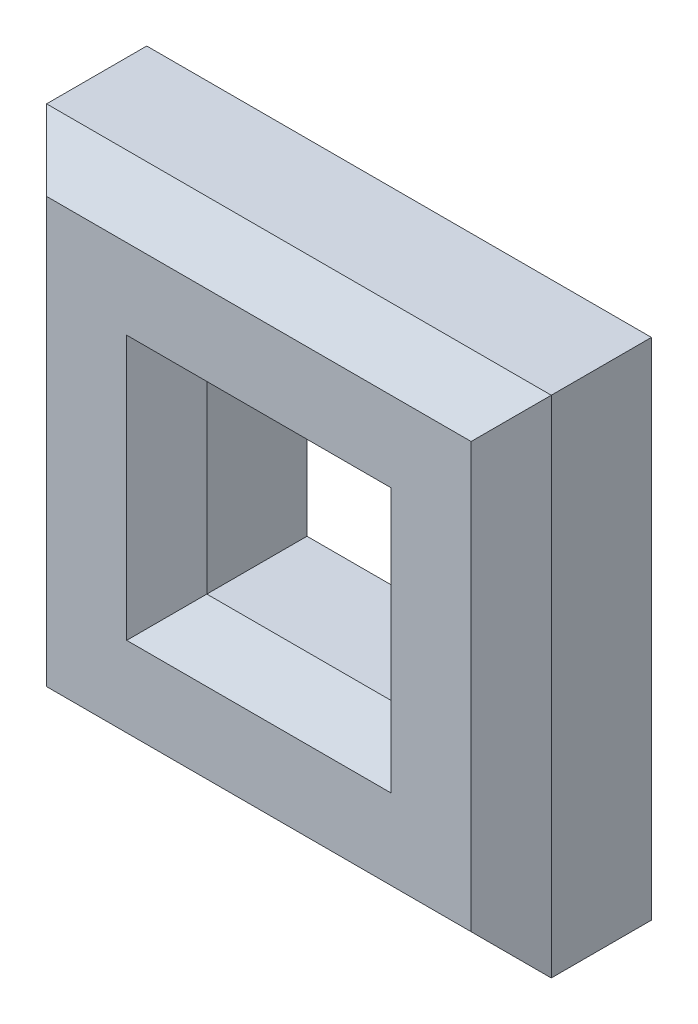
ISO-10303-21;
HEADER;
FILE_DESCRIPTION(('STEP AP214'),'2;1');
FILE_NAME('part.step','',(''),(''),'','','');
FILE_SCHEMA(('AUTOMOTIVE_DESIGN { 1 0 10303 214 1 1 1 1 }'));
ENDSEC;
DATA;
#1=APPLICATION_CONTEXT('core data for automotive mechanical design processes');
#2=APPLICATION_PROTOCOL_DEFINITION('international standard','automotive_design',2000,#1);
#3=PRODUCT_CONTEXT('',#1,'mechanical');
#4=PRODUCT('Part','Part','',(#3));
#5=PRODUCT_RELATED_PRODUCT_CATEGORY('part','',(#4));
#6=PRODUCT_DEFINITION_FORMATION('','',#4);
#7=PRODUCT_DEFINITION_CONTEXT('part definition',#1,'design');
#8=PRODUCT_DEFINITION('design','',#6,#7);
#9=PRODUCT_DEFINITION_SHAPE('','',#8);
#10=(LENGTH_UNIT() NAMED_UNIT(*) SI_UNIT(.MILLI.,.METRE.));
#11=(NAMED_UNIT(*) PLANE_ANGLE_UNIT() SI_UNIT($,.RADIAN.));
#12=(NAMED_UNIT(*) SI_UNIT($,.STERADIAN.) SOLID_ANGLE_UNIT());
#13=UNCERTAINTY_MEASURE_WITH_UNIT(LENGTH_MEASURE(1.E-05),#10,'distance_accuracy_value','');
#14=(GEOMETRIC_REPRESENTATION_CONTEXT(3) GLOBAL_UNCERTAINTY_ASSIGNED_CONTEXT((#13)) GLOBAL_UNIT_ASSIGNED_CONTEXT((#10,
#11,#12)) REPRESENTATION_CONTEXT('',''));
#15=CARTESIAN_POINT('',(0.,0.,0.));
#16=DIRECTION('',(0.,0.,1.));
#17=DIRECTION('',(1.,0.,0.));
#18=AXIS2_PLACEMENT_3D('',#15,#16,#17);
#19=CARTESIAN_POINT('',(0.,0.,3.5));
#20=DIRECTION('',(0.,0.,1.));
#21=DIRECTION('',(1.,0.,0.));
#22=AXIS2_PLACEMENT_3D('',#19,#20,#21);
#23=PLANE('',#22);
#24=DIRECTION('',(1.,0.,0.));
#25=VECTOR('',#24,1.);
#26=CARTESIAN_POINT('',(0.,3.29809703885628,3.5));
#27=LINE('',#26,#25);
#28=CARTESIAN_POINT('',(-3.29809703885628,3.29809703885628,3.5));
#29=VERTEX_POINT('',#28);
#30=CARTESIAN_POINT('',(3.29809703885628,3.29809703885628,3.5));
#31=VERTEX_POINT('',#30);
#32=EDGE_CURVE('E200',#29,#31,#27,.T.);
#33=ORIENTED_EDGE('',*,*,#32,.T.);
#34=DIRECTION('',(0.,-1.,0.));
#35=VECTOR('',#34,1.);
#36=CARTESIAN_POINT('',(3.29809703885628,0.,3.5));
#37=LINE('',#36,#35);
#38=CARTESIAN_POINT('',(3.29809703885628,-3.29809703885628,3.5));
#39=VERTEX_POINT('',#38);
#40=EDGE_CURVE('E202',#31,#39,#37,.T.);
#41=ORIENTED_EDGE('',*,*,#40,.T.);
#42=DIRECTION('',(-1.,0.,0.));
#43=VECTOR('',#42,1.);
#44=CARTESIAN_POINT('',(0.,-3.29809703885628,3.5));
#45=LINE('',#44,#43);
#46=CARTESIAN_POINT('',(-3.29809703885628,-3.29809703885628,3.5));
#47=VERTEX_POINT('',#46);
#48=EDGE_CURVE('E196',#39,#47,#45,.T.);
#49=ORIENTED_EDGE('',*,*,#48,.T.);
#50=DIRECTION('',(0.,1.,0.));
#51=VECTOR('',#50,1.);
#52=CARTESIAN_POINT('',(-3.29809703885628,0.,3.5));
#53=LINE('',#52,#51);
#54=EDGE_CURVE('E198',#47,#29,#53,.T.);
#55=ORIENTED_EDGE('',*,*,#54,.T.);
#56=EDGE_LOOP('',(#33,#41,#49,#55));
#57=FACE_BOUND('',#56,.T.);
#58=DIRECTION('',(0.,1.,0.));
#59=VECTOR('',#58,1.);
#60=CARTESIAN_POINT('',(5.29809703885629,6.29809703885628,3.5));
#61=LINE('',#60,#59);
#62=CARTESIAN_POINT('',(5.29809703885629,-5.29809703885628,3.5));
#63=VERTEX_POINT('',#62);
#64=CARTESIAN_POINT('',(5.29809703885629,5.29809703885629,3.5));
#65=VERTEX_POINT('',#64);
#66=EDGE_CURVE('E191',#63,#65,#61,.T.);
#67=ORIENTED_EDGE('',*,*,#66,.T.);
#68=DIRECTION('',(-1.,0.,0.));
#69=VECTOR('',#68,1.);
#70=CARTESIAN_POINT('',(-6.29809703885628,5.29809703885629,3.5));
#71=LINE('',#70,#69);
#72=CARTESIAN_POINT('',(-5.29809703885629,5.29809703885629,3.5));
#73=VERTEX_POINT('',#72);
#74=EDGE_CURVE('E193',#65,#73,#71,.T.);
#75=ORIENTED_EDGE('',*,*,#74,.T.);
#76=DIRECTION('',(0.,-1.,0.));
#77=VECTOR('',#76,1.);
#78=CARTESIAN_POINT('',(-5.29809703885629,-6.29809703885628,3.5));
#79=LINE('',#78,#77);
#80=CARTESIAN_POINT('',(-5.29809703885629,-5.29809703885628,3.5));
#81=VERTEX_POINT('',#80);
#82=EDGE_CURVE('E187',#73,#81,#79,.T.);
#83=ORIENTED_EDGE('',*,*,#82,.T.);
#84=DIRECTION('',(1.,0.,0.));
#85=VECTOR('',#84,1.);
#86=CARTESIAN_POINT('',(6.29809703885628,-5.29809703885628,3.5));
#87=LINE('',#86,#85);
#88=EDGE_CURVE('E189',#81,#63,#87,.T.);
#89=ORIENTED_EDGE('',*,*,#88,.T.);
#90=EDGE_LOOP('',(#67,#75,#83,#89));
#91=FACE_BOUND('',#90,.T.);
#92=ADVANCED_FACE('F35',(#57,#91),#23,.T.);
#93=CARTESIAN_POINT('',(0.,0.,0.));
#94=DIRECTION('',(0.,0.,1.));
#95=DIRECTION('',(1.,0.,0.));
#96=AXIS2_PLACEMENT_3D('',#93,#94,#95);
#97=PLANE('',#96);
#98=DIRECTION('',(0.,-1.,0.));
#99=VECTOR('',#98,1.);
#100=CARTESIAN_POINT('',(-6.29809703885628,-6.29809703885628,0.));
#101=LINE('',#100,#99);
#102=CARTESIAN_POINT('',(-6.29809703885628,6.29809703885628,0.));
#103=VERTEX_POINT('',#102);
#104=CARTESIAN_POINT('',(-6.29809703885628,-6.29809703885628,0.));
#105=VERTEX_POINT('',#104);
#106=EDGE_CURVE('E137',#103,#105,#101,.T.);
#107=ORIENTED_EDGE('',*,*,#106,.F.);
#108=DIRECTION('',(-1.,0.,0.));
#109=VECTOR('',#108,1.);
#110=CARTESIAN_POINT('',(6.29809703885628,6.29809703885628,0.));
#111=LINE('',#110,#109);
#112=CARTESIAN_POINT('',(6.29809703885628,6.29809703885628,0.));
#113=VERTEX_POINT('',#112);
#114=EDGE_CURVE('E173',#113,#103,#111,.T.);
#115=ORIENTED_EDGE('',*,*,#114,.F.);
#116=DIRECTION('',(0.,1.,0.));
#117=VECTOR('',#116,1.);
#118=CARTESIAN_POINT('',(6.29809703885628,-6.29809703885628,0.));
#119=LINE('',#118,#117);
#120=CARTESIAN_POINT('',(6.29809703885628,-6.29809703885628,0.));
#121=VERTEX_POINT('',#120);
#122=EDGE_CURVE('E170',#121,#113,#119,.T.);
#123=ORIENTED_EDGE('',*,*,#122,.F.);
#124=DIRECTION('',(1.,0.,0.));
#125=VECTOR('',#124,1.);
#126=CARTESIAN_POINT('',(6.29809703885628,-6.29809703885628,0.));
#127=LINE('',#126,#125);
#128=EDGE_CURVE('E167',#105,#121,#127,.T.);
#129=ORIENTED_EDGE('',*,*,#128,.F.);
#130=EDGE_LOOP('',(#107,#115,#123,#129));
#131=FACE_BOUND('',#130,.T.);
#132=DIRECTION('',(0.,-1.,0.));
#133=VECTOR('',#132,1.);
#134=CARTESIAN_POINT('',(-2.29809703885628,-2.29809703885628,0.));
#135=LINE('',#134,#133);
#136=CARTESIAN_POINT('',(-2.29809703885628,2.29809703885628,0.));
#137=VERTEX_POINT('',#136);
#138=CARTESIAN_POINT('',(-2.29809703885628,-2.29809703885628,0.));
#139=VERTEX_POINT('',#138);
#140=EDGE_CURVE('E131',#137,#139,#135,.T.);
#141=ORIENTED_EDGE('',*,*,#140,.T.);
#142=DIRECTION('',(1.,0.,0.));
#143=VECTOR('',#142,1.);
#144=CARTESIAN_POINT('',(2.29809703885628,-2.29809703885628,0.));
#145=LINE('',#144,#143);
#146=CARTESIAN_POINT('',(2.29809703885628,-2.29809703885628,0.));
#147=VERTEX_POINT('',#146);
#148=EDGE_CURVE('E141',#139,#147,#145,.T.);
#149=ORIENTED_EDGE('',*,*,#148,.T.);
#150=DIRECTION('',(0.,1.,0.));
#151=VECTOR('',#150,1.);
#152=CARTESIAN_POINT('',(2.29809703885628,-2.29809703885628,0.));
#153=LINE('',#152,#151);
#154=CARTESIAN_POINT('',(2.29809703885628,2.29809703885628,0.));
#155=VERTEX_POINT('',#154);
#156=EDGE_CURVE('E147',#147,#155,#153,.T.);
#157=ORIENTED_EDGE('',*,*,#156,.T.);
#158=DIRECTION('',(-1.,0.,0.));
#159=VECTOR('',#158,1.);
#160=CARTESIAN_POINT('',(2.29809703885628,2.29809703885628,0.));
#161=LINE('',#160,#159);
#162=EDGE_CURVE('E151',#155,#137,#161,.T.);
#163=ORIENTED_EDGE('',*,*,#162,.T.);
#164=EDGE_LOOP('',(#141,#149,#157,#163));
#165=FACE_BOUND('',#164,.T.);
#166=ADVANCED_FACE('F149',(#131,#165),#97,.F.);
#167=CARTESIAN_POINT('',(-6.29809703885628,-6.29809703885628,3.5));
#168=DIRECTION('',(1.,0.,0.));
#169=DIRECTION('',(0.,0.,-1.));
#170=AXIS2_PLACEMENT_3D('',#167,#168,#169);
#171=PLANE('',#170);
#172=DIRECTION('',(0.,0.,-1.));
#173=VECTOR('',#172,1.);
#174=CARTESIAN_POINT('',(-6.29809703885628,-6.29809703885628,3.5));
#175=LINE('',#174,#173);
#176=CARTESIAN_POINT('',(-6.29809703885628,-6.29809703885628,2.5));
#177=VERTEX_POINT('',#176);
#178=EDGE_CURVE('E182',#177,#105,#175,.T.);
#179=ORIENTED_EDGE('',*,*,#178,.F.);
#180=DIRECTION('',(0.,1.,0.));
#181=VECTOR('',#180,1.);
#182=CARTESIAN_POINT('',(-6.29809703885628,6.29809703885628,2.5));
#183=LINE('',#182,#181);
#184=CARTESIAN_POINT('',(-6.29809703885628,6.29809703885628,2.5));
#185=VERTEX_POINT('',#184);
#186=EDGE_CURVE('E11',#177,#185,#183,.T.);
#187=ORIENTED_EDGE('',*,*,#186,.T.);
#188=DIRECTION('',(0.,0.,-1.));
#189=VECTOR('',#188,1.);
#190=CARTESIAN_POINT('',(-6.29809703885628,6.29809703885628,3.5));
#191=LINE('',#190,#189);
#192=EDGE_CURVE('E176',#185,#103,#191,.T.);
#193=ORIENTED_EDGE('',*,*,#192,.T.);
#194=ORIENTED_EDGE('',*,*,#106,.T.);
#195=EDGE_LOOP('',(#179,#187,#193,#194));
#196=FACE_BOUND('',#195,.T.);
#197=ADVANCED_FACE('F242',(#196),#171,.F.);
#198=CARTESIAN_POINT('',(6.29809703885628,-6.29809703885628,3.5));
#199=DIRECTION('',(0.,1.,0.));
#200=DIRECTION('',(0.,0.,1.));
#201=AXIS2_PLACEMENT_3D('',#198,#199,#200);
#202=PLANE('',#201);
#203=DIRECTION('',(0.,0.,-1.));
#204=VECTOR('',#203,1.);
#205=CARTESIAN_POINT('',(6.29809703885628,-6.29809703885628,3.5));
#206=LINE('',#205,#204);
#207=CARTESIAN_POINT('',(6.29809703885628,-6.29809703885628,2.5));
#208=VERTEX_POINT('',#207);
#209=EDGE_CURVE('E180',#208,#121,#206,.T.);
#210=ORIENTED_EDGE('',*,*,#209,.F.);
#211=DIRECTION('',(-1.,0.,0.));
#212=VECTOR('',#211,1.);
#213=CARTESIAN_POINT('',(-6.29809703885628,-6.29809703885628,2.5));
#214=LINE('',#213,#212);
#215=EDGE_CURVE('E45',#208,#177,#214,.T.);
#216=ORIENTED_EDGE('',*,*,#215,.T.);
#217=ORIENTED_EDGE('',*,*,#178,.T.);
#218=ORIENTED_EDGE('',*,*,#128,.T.);
#219=EDGE_LOOP('',(#210,#216,#217,#218));
#220=FACE_BOUND('',#219,.T.);
#221=ADVANCED_FACE('F268',(#220),#202,.F.);
#222=CARTESIAN_POINT('',(6.29809703885628,-6.29809703885628,3.5));
#223=DIRECTION('',(-1.,0.,0.));
#224=DIRECTION('',(0.,0.,1.));
#225=AXIS2_PLACEMENT_3D('',#222,#223,#224);
#226=PLANE('',#225);
#227=DIRECTION('',(0.,0.,-1.));
#228=VECTOR('',#227,1.);
#229=CARTESIAN_POINT('',(6.29809703885628,6.29809703885628,3.5));
#230=LINE('',#229,#228);
#231=CARTESIAN_POINT('',(6.29809703885628,6.29809703885628,2.5));
#232=VERTEX_POINT('',#231);
#233=EDGE_CURVE('E178',#232,#113,#230,.T.);
#234=ORIENTED_EDGE('',*,*,#233,.F.);
#235=DIRECTION('',(0.,-1.,0.));
#236=VECTOR('',#235,1.);
#237=CARTESIAN_POINT('',(6.29809703885628,-6.29809703885628,2.5));
#238=LINE('',#237,#236);
#239=EDGE_CURVE('E60',#232,#208,#238,.T.);
#240=ORIENTED_EDGE('',*,*,#239,.T.);
#241=ORIENTED_EDGE('',*,*,#209,.T.);
#242=ORIENTED_EDGE('',*,*,#122,.T.);
#243=EDGE_LOOP('',(#234,#240,#241,#242));
#244=FACE_BOUND('',#243,.T.);
#245=ADVANCED_FACE('F265',(#244),#226,.F.);
#246=CARTESIAN_POINT('',(6.29809703885628,6.29809703885628,3.5));
#247=DIRECTION('',(0.,-1.,0.));
#248=DIRECTION('',(0.,0.,-1.));
#249=AXIS2_PLACEMENT_3D('',#246,#247,#248);
#250=PLANE('',#249);
#251=ORIENTED_EDGE('',*,*,#192,.F.);
#252=DIRECTION('',(1.,0.,0.));
#253=VECTOR('',#252,1.);
#254=CARTESIAN_POINT('',(6.29809703885628,6.29809703885628,2.5));
#255=LINE('',#254,#253);
#256=EDGE_CURVE('E210',#185,#232,#255,.T.);
#257=ORIENTED_EDGE('',*,*,#256,.T.);
#258=ORIENTED_EDGE('',*,*,#233,.T.);
#259=ORIENTED_EDGE('',*,*,#114,.T.);
#260=EDGE_LOOP('',(#251,#257,#258,#259));
#261=FACE_BOUND('',#260,.T.);
#262=ADVANCED_FACE('F245',(#261),#250,.F.);
#263=CARTESIAN_POINT('',(-2.29809703885628,-2.29809703885628,3.5));
#264=DIRECTION('',(1.,0.,0.));
#265=DIRECTION('',(0.,0.,-1.));
#266=AXIS2_PLACEMENT_3D('',#263,#264,#265);
#267=PLANE('',#266);
#268=DIRECTION('',(0.,0.,-1.));
#269=VECTOR('',#268,1.);
#270=CARTESIAN_POINT('',(-2.29809703885628,2.29809703885628,3.5));
#271=LINE('',#270,#269);
#272=CARTESIAN_POINT('',(-2.29809703885628,2.29809703885628,2.5));
#273=VERTEX_POINT('',#272);
#274=EDGE_CURVE('E160',#273,#137,#271,.T.);
#275=ORIENTED_EDGE('',*,*,#274,.F.);
#276=DIRECTION('',(0.,-1.,0.));
#277=VECTOR('',#276,1.);
#278=CARTESIAN_POINT('',(-2.29809703885628,-2.29809703885628,2.5));
#279=LINE('',#278,#277);
#280=CARTESIAN_POINT('',(-2.29809703885628,-2.29809703885628,2.5));
#281=VERTEX_POINT('',#280);
#282=EDGE_CURVE('E134',#273,#281,#279,.T.);
#283=ORIENTED_EDGE('',*,*,#282,.T.);
#284=DIRECTION('',(0.,0.,-1.));
#285=VECTOR('',#284,1.);
#286=CARTESIAN_POINT('',(-2.29809703885628,-2.29809703885628,3.5));
#287=LINE('',#286,#285);
#288=EDGE_CURVE('E126',#281,#139,#287,.T.);
#289=ORIENTED_EDGE('',*,*,#288,.T.);
#290=ORIENTED_EDGE('',*,*,#140,.F.);
#291=EDGE_LOOP('',(#275,#283,#289,#290));
#292=FACE_BOUND('',#291,.T.);
#293=ADVANCED_FACE('F129',(#292),#267,.T.);
#294=CARTESIAN_POINT('',(2.29809703885628,-2.29809703885628,3.5));
#295=DIRECTION('',(0.,1.,0.));
#296=DIRECTION('',(0.,0.,1.));
#297=AXIS2_PLACEMENT_3D('',#294,#295,#296);
#298=PLANE('',#297);
#299=ORIENTED_EDGE('',*,*,#288,.F.);
#300=DIRECTION('',(1.,0.,0.));
#301=VECTOR('',#300,1.);
#302=CARTESIAN_POINT('',(2.29809703885628,-2.29809703885628,2.5));
#303=LINE('',#302,#301);
#304=CARTESIAN_POINT('',(2.29809703885628,-2.29809703885628,2.5));
#305=VERTEX_POINT('',#304);
#306=EDGE_CURVE('E208',#281,#305,#303,.T.);
#307=ORIENTED_EDGE('',*,*,#306,.T.);
#308=DIRECTION('',(0.,0.,-1.));
#309=VECTOR('',#308,1.);
#310=CARTESIAN_POINT('',(2.29809703885628,-2.29809703885628,3.5));
#311=LINE('',#310,#309);
#312=EDGE_CURVE('E138',#305,#147,#311,.T.);
#313=ORIENTED_EDGE('',*,*,#312,.T.);
#314=ORIENTED_EDGE('',*,*,#148,.F.);
#315=EDGE_LOOP('',(#299,#307,#313,#314));
#316=FACE_BOUND('',#315,.T.);
#317=ADVANCED_FACE('F142',(#316),#298,.T.);
#318=CARTESIAN_POINT('',(2.29809703885628,-2.29809703885628,3.5));
#319=DIRECTION('',(-1.,0.,0.));
#320=DIRECTION('',(0.,0.,1.));
#321=AXIS2_PLACEMENT_3D('',#318,#319,#320);
#322=PLANE('',#321);
#323=ORIENTED_EDGE('',*,*,#312,.F.);
#324=DIRECTION('',(0.,1.,0.));
#325=VECTOR('',#324,1.);
#326=CARTESIAN_POINT('',(2.29809703885628,-2.29809703885628,2.5));
#327=LINE('',#326,#325);
#328=CARTESIAN_POINT('',(2.29809703885628,2.29809703885628,2.5));
#329=VERTEX_POINT('',#328);
#330=EDGE_CURVE('E184',#305,#329,#327,.T.);
#331=ORIENTED_EDGE('',*,*,#330,.T.);
#332=DIRECTION('',(0.,0.,-1.));
#333=VECTOR('',#332,1.);
#334=CARTESIAN_POINT('',(2.29809703885628,2.29809703885628,3.5));
#335=LINE('',#334,#333);
#336=EDGE_CURVE('E162',#329,#155,#335,.T.);
#337=ORIENTED_EDGE('',*,*,#336,.T.);
#338=ORIENTED_EDGE('',*,*,#156,.F.);
#339=EDGE_LOOP('',(#323,#331,#337,#338));
#340=FACE_BOUND('',#339,.T.);
#341=ADVANCED_FACE('F342',(#340),#322,.T.);
#342=CARTESIAN_POINT('',(2.29809703885628,2.29809703885628,3.5));
#343=DIRECTION('',(0.,-1.,0.));
#344=DIRECTION('',(0.,0.,-1.));
#345=AXIS2_PLACEMENT_3D('',#342,#343,#344);
#346=PLANE('',#345);
#347=ORIENTED_EDGE('',*,*,#336,.F.);
#348=DIRECTION('',(-1.,0.,0.));
#349=VECTOR('',#348,1.);
#350=CARTESIAN_POINT('',(2.29809703885628,2.29809703885628,2.5));
#351=LINE('',#350,#349);
#352=EDGE_CURVE('E205',#329,#273,#351,.T.);
#353=ORIENTED_EDGE('',*,*,#352,.T.);
#354=ORIENTED_EDGE('',*,*,#274,.T.);
#355=ORIENTED_EDGE('',*,*,#162,.F.);
#356=EDGE_LOOP('',(#347,#353,#354,#355));
#357=FACE_BOUND('',#356,.T.);
#358=ADVANCED_FACE('F300',(#357),#346,.T.);
#359=CARTESIAN_POINT('',(-2.29809703885628,-2.29809703885628,2.5));
#360=DIRECTION('',(-0.707106781186547,0.,-0.707106781186548));
#361=DIRECTION('',(0.,-1.,0.));
#362=AXIS2_PLACEMENT_3D('',#359,#360,#361);
#363=PLANE('',#362);
#364=DIRECTION('',(-0.577350269189626,0.577350269189626,0.577350269189625));
#365=VECTOR('',#364,1.);
#366=CARTESIAN_POINT('',(-0.766032346285425,0.766032346285425,0.967935307429147));
#367=LINE('',#366,#365);
#368=EDGE_CURVE('E155',#29,#273,#367,.F.);
#369=ORIENTED_EDGE('',*,*,#368,.F.);
#370=ORIENTED_EDGE('',*,*,#54,.F.);
#371=DIRECTION('',(-0.577350269189626,-0.577350269189626,0.577350269189625));
#372=VECTOR('',#371,1.);
#373=CARTESIAN_POINT('',(-2.29809703885628,-2.29809703885628,2.5));
#374=LINE('',#373,#372);
#375=EDGE_CURVE('E152',#281,#47,#374,.T.);
#376=ORIENTED_EDGE('',*,*,#375,.F.);
#377=ORIENTED_EDGE('',*,*,#282,.F.);
#378=EDGE_LOOP('',(#369,#370,#376,#377));
#379=FACE_BOUND('',#378,.T.);
#380=ADVANCED_FACE('F294',(#379),#363,.F.);
#381=CARTESIAN_POINT('',(2.29809703885628,-2.29809703885628,2.5));
#382=DIRECTION('',(0.,-0.707106781186547,-0.707106781186548));
#383=DIRECTION('',(1.,0.,0.));
#384=AXIS2_PLACEMENT_3D('',#381,#382,#383);
#385=PLANE('',#384);
#386=ORIENTED_EDGE('',*,*,#375,.T.);
#387=ORIENTED_EDGE('',*,*,#48,.F.);
#388=DIRECTION('',(-0.577350269189626,0.577350269189626,-0.577350269189625));
#389=VECTOR('',#388,1.);
#390=CARTESIAN_POINT('',(2.29809703885628,-2.29809703885628,2.5));
#391=LINE('',#390,#389);
#392=EDGE_CURVE('E217',#305,#39,#391,.F.);
#393=ORIENTED_EDGE('',*,*,#392,.F.);
#394=ORIENTED_EDGE('',*,*,#306,.F.);
#395=EDGE_LOOP('',(#386,#387,#393,#394));
#396=FACE_BOUND('',#395,.T.);
#397=ADVANCED_FACE('F287',(#396),#385,.F.);
#398=CARTESIAN_POINT('',(2.29809703885628,2.29809703885628,2.5));
#399=DIRECTION('',(0.,0.707106781186547,-0.707106781186548));
#400=DIRECTION('',(-1.,0.,0.));
#401=AXIS2_PLACEMENT_3D('',#398,#399,#400);
#402=PLANE('',#401);
#403=ORIENTED_EDGE('',*,*,#368,.T.);
#404=ORIENTED_EDGE('',*,*,#352,.F.);
#405=DIRECTION('',(0.577350269189626,0.577350269189626,0.577350269189625));
#406=VECTOR('',#405,1.);
#407=CARTESIAN_POINT('',(0.766032346285424,0.766032346285425,0.967935307429147));
#408=LINE('',#407,#406);
#409=EDGE_CURVE('E215',#31,#329,#408,.F.);
#410=ORIENTED_EDGE('',*,*,#409,.F.);
#411=ORIENTED_EDGE('',*,*,#32,.F.);
#412=EDGE_LOOP('',(#403,#404,#410,#411));
#413=FACE_BOUND('',#412,.T.);
#414=ADVANCED_FACE('F280',(#413),#402,.F.);
#415=CARTESIAN_POINT('',(2.29809703885628,-2.29809703885628,2.5));
#416=DIRECTION('',(0.707106781186547,0.,-0.707106781186548));
#417=DIRECTION('',(0.,1.,0.));
#418=AXIS2_PLACEMENT_3D('',#415,#416,#417);
#419=PLANE('',#418);
#420=ORIENTED_EDGE('',*,*,#392,.T.);
#421=ORIENTED_EDGE('',*,*,#40,.F.);
#422=ORIENTED_EDGE('',*,*,#409,.T.);
#423=ORIENTED_EDGE('',*,*,#330,.F.);
#424=EDGE_LOOP('',(#420,#421,#422,#423));
#425=FACE_BOUND('',#424,.T.);
#426=ADVANCED_FACE('F274',(#425),#419,.F.);
#427=CARTESIAN_POINT('',(0.,-5.29809703885628,3.5));
#428=DIRECTION('',(0.,-0.707106781186549,0.707106781186546));
#429=DIRECTION('',(-1.,0.,0.));
#430=AXIS2_PLACEMENT_3D('',#427,#428,#429);
#431=PLANE('',#430);
#432=DIRECTION('',(0.577350269189625,0.577350269189625,0.577350269189628));
#433=VECTOR('',#432,1.);
#434=CARTESIAN_POINT('',(-3.53206469257086,-3.53206469257086,5.26603234628543));
#435=LINE('',#434,#433);
#436=EDGE_CURVE('E224',#177,#81,#435,.T.);
#437=ORIENTED_EDGE('',*,*,#436,.F.);
#438=ORIENTED_EDGE('',*,*,#215,.F.);
#439=DIRECTION('',(-0.577350269189624,0.577350269189625,0.577350269189628));
#440=VECTOR('',#439,1.);
#441=CARTESIAN_POINT('',(3.53206469257087,-3.53206469257086,5.26603234628543));
#442=LINE('',#441,#440);
#443=EDGE_CURVE('E40',#63,#208,#442,.F.);
#444=ORIENTED_EDGE('',*,*,#443,.F.);
#445=ORIENTED_EDGE('',*,*,#88,.F.);
#446=EDGE_LOOP('',(#437,#438,#444,#445));
#447=FACE_BOUND('',#446,.T.);
#448=ADVANCED_FACE('F38',(#447),#431,.T.);
#449=CARTESIAN_POINT('',(5.29809703885629,0.,3.5));
#450=DIRECTION('',(0.70710678118655,0.,0.707106781186545));
#451=DIRECTION('',(0.,-1.,0.));
#452=AXIS2_PLACEMENT_3D('',#449,#450,#451);
#453=PLANE('',#452);
#454=ORIENTED_EDGE('',*,*,#443,.T.);
#455=ORIENTED_EDGE('',*,*,#239,.F.);
#456=DIRECTION('',(-0.577350269189624,-0.577350269189625,0.577350269189628));
#457=VECTOR('',#456,1.);
#458=CARTESIAN_POINT('',(3.53206469257086,3.53206469257086,5.26603234628543));
#459=LINE('',#458,#457);
#460=EDGE_CURVE('E223',#65,#232,#459,.F.);
#461=ORIENTED_EDGE('',*,*,#460,.F.);
#462=ORIENTED_EDGE('',*,*,#66,.F.);
#463=EDGE_LOOP('',(#454,#455,#461,#462));
#464=FACE_BOUND('',#463,.T.);
#465=ADVANCED_FACE('F234',(#464),#453,.T.);
#466=CARTESIAN_POINT('',(-5.29809703885629,0.,3.5));
#467=DIRECTION('',(-0.707106781186549,0.,0.707106781186546));
#468=DIRECTION('',(0.,1.,0.));
#469=AXIS2_PLACEMENT_3D('',#466,#467,#468);
#470=PLANE('',#469);
#471=ORIENTED_EDGE('',*,*,#436,.T.);
#472=ORIENTED_EDGE('',*,*,#82,.F.);
#473=DIRECTION('',(-0.577350269189625,0.577350269189625,-0.577350269189628));
#474=VECTOR('',#473,1.);
#475=CARTESIAN_POINT('',(-3.53206469257086,3.53206469257086,5.26603234628543));
#476=LINE('',#475,#474);
#477=EDGE_CURVE('E221',#185,#73,#476,.F.);
#478=ORIENTED_EDGE('',*,*,#477,.F.);
#479=ORIENTED_EDGE('',*,*,#186,.F.);
#480=EDGE_LOOP('',(#471,#472,#478,#479));
#481=FACE_BOUND('',#480,.T.);
#482=ADVANCED_FACE('F239',(#481),#470,.T.);
#483=CARTESIAN_POINT('',(0.,5.29809703885629,3.5));
#484=DIRECTION('',(0.,0.707106781186549,0.707106781186546));
#485=DIRECTION('',(1.,0.,0.));
#486=AXIS2_PLACEMENT_3D('',#483,#484,#485);
#487=PLANE('',#486);
#488=ORIENTED_EDGE('',*,*,#460,.T.);
#489=ORIENTED_EDGE('',*,*,#256,.F.);
#490=ORIENTED_EDGE('',*,*,#477,.T.);
#491=ORIENTED_EDGE('',*,*,#74,.F.);
#492=EDGE_LOOP('',(#488,#489,#490,#491));
#493=FACE_BOUND('',#492,.T.);
#494=ADVANCED_FACE('F249',(#493),#487,.T.);
#495=CLOSED_SHELL('',(#92,#166,#197,#221,#245,#262,#293,#317,#341,#358,#380,#397,#414,#426,#448,
#465,#482,#494));
#496=MANIFOLD_SOLID_BREP('B2',#495);
#497=ADVANCED_BREP_SHAPE_REPRESENTATION('',(#18,#496),#14);
#498=SHAPE_DEFINITION_REPRESENTATION(#9,#497);
ENDSEC;
END-ISO-10303-21;
